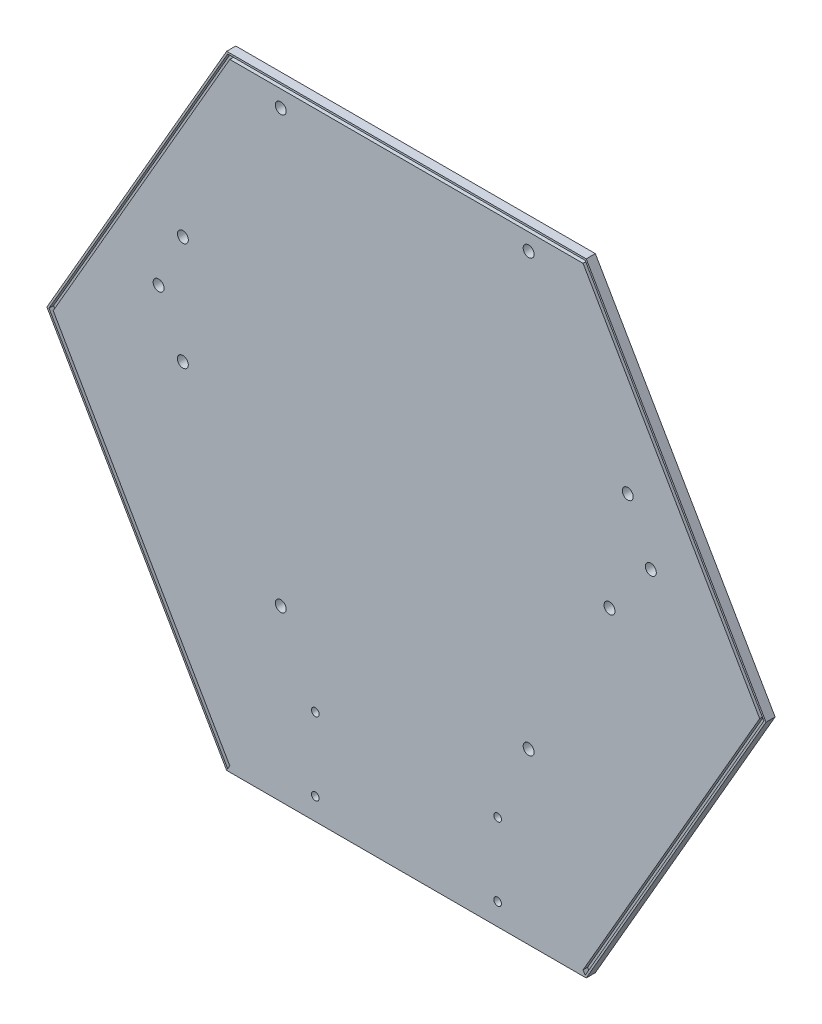
ISO-10303-21;
HEADER;
FILE_DESCRIPTION(('STEP AP214'),'2;1');
FILE_NAME('part.step','',(''),(''),'','','');
FILE_SCHEMA(('AUTOMOTIVE_DESIGN { 1 0 10303 214 1 1 1 1 }'));
ENDSEC;
DATA;
#1=APPLICATION_CONTEXT('core data for automotive mechanical design processes');
#2=APPLICATION_PROTOCOL_DEFINITION('international standard','automotive_design',2000,#1);
#3=PRODUCT_CONTEXT('',#1,'mechanical');
#4=PRODUCT('Part','Part','',(#3));
#5=PRODUCT_RELATED_PRODUCT_CATEGORY('part','',(#4));
#6=PRODUCT_DEFINITION_FORMATION('','',#4);
#7=PRODUCT_DEFINITION_CONTEXT('part definition',#1,'design');
#8=PRODUCT_DEFINITION('design','',#6,#7);
#9=PRODUCT_DEFINITION_SHAPE('','',#8);
#10=(LENGTH_UNIT() NAMED_UNIT(*) SI_UNIT(.MILLI.,.METRE.));
#11=(NAMED_UNIT(*) PLANE_ANGLE_UNIT() SI_UNIT($,.RADIAN.));
#12=(NAMED_UNIT(*) SI_UNIT($,.STERADIAN.) SOLID_ANGLE_UNIT());
#13=UNCERTAINTY_MEASURE_WITH_UNIT(LENGTH_MEASURE(1.E-05),#10,'distance_accuracy_value','');
#14=(GEOMETRIC_REPRESENTATION_CONTEXT(3) GLOBAL_UNCERTAINTY_ASSIGNED_CONTEXT((#13)) GLOBAL_UNIT_ASSIGNED_CONTEXT((#10,
#11,#12)) REPRESENTATION_CONTEXT('',''));
#15=CARTESIAN_POINT('',(0.,0.,0.));
#16=DIRECTION('',(0.,0.,1.));
#17=DIRECTION('',(1.,0.,0.));
#18=AXIS2_PLACEMENT_3D('',#15,#16,#17);
#19=CARTESIAN_POINT('',(0.,0.,25.));
#20=DIRECTION('',(0.,0.,1.));
#21=DIRECTION('',(1.,0.,0.));
#22=AXIS2_PLACEMENT_3D('',#19,#20,#21);
#23=PLANE('',#22);
#24=CARTESIAN_POINT('',(50.9544013648364,-199.783155320155,25.));
#25=DIRECTION('',(0.,0.,1.));
#26=DIRECTION('',(-1.,0.,0.));
#27=AXIS2_PLACEMENT_3D('',#24,#25,#26);
#28=CIRCLE('',#27,2.1);
#29=CARTESIAN_POINT('',(48.8544013648363,-199.783155320155,25.));
#30=VERTEX_POINT('',#29);
#31=EDGE_CURVE('E344',#30,#30,#28,.T.);
#32=ORIENTED_EDGE('',*,*,#31,.F.);
#33=EDGE_LOOP('',(#32));
#34=FACE_BOUND('',#33,.T.);
#35=CARTESIAN_POINT('',(-49.0455986351637,-159.783155320155,25.));
#36=DIRECTION('',(0.,0.,1.));
#37=DIRECTION('',(1.,0.,0.));
#38=AXIS2_PLACEMENT_3D('',#35,#36,#37);
#39=CIRCLE('',#38,2.09999999999999);
#40=CARTESIAN_POINT('',(-46.9455986351637,-159.783155320155,25.));
#41=VERTEX_POINT('',#40);
#42=EDGE_CURVE('E337',#41,#41,#39,.T.);
#43=ORIENTED_EDGE('',*,*,#42,.F.);
#44=EDGE_LOOP('',(#43));
#45=FACE_BOUND('',#44,.T.);
#46=CARTESIAN_POINT('',(50.9544013648398,-159.783155320154,25.));
#47=DIRECTION('',(0.,0.,1.));
#48=DIRECTION('',(-1.,0.,0.));
#49=AXIS2_PLACEMENT_3D('',#46,#47,#48);
#50=CIRCLE('',#49,2.10000000000001);
#51=CARTESIAN_POINT('',(48.8544013648397,-159.783155320154,25.));
#52=VERTEX_POINT('',#51);
#53=EDGE_CURVE('E349',#52,#52,#50,.T.);
#54=ORIENTED_EDGE('',*,*,#53,.F.);
#55=EDGE_LOOP('',(#54));
#56=FACE_BOUND('',#55,.T.);
#57=CARTESIAN_POINT('',(-49.0455986351636,-199.783155320155,25.));
#58=DIRECTION('',(0.,0.,1.));
#59=DIRECTION('',(1.,0.,0.));
#60=AXIS2_PLACEMENT_3D('',#57,#58,#59);
#61=CIRCLE('',#60,2.1);
#62=CARTESIAN_POINT('',(-46.9455986351636,-199.783155320155,25.));
#63=VERTEX_POINT('',#62);
#64=EDGE_CURVE('E281',#63,#63,#61,.T.);
#65=ORIENTED_EDGE('',*,*,#64,.F.);
#66=EDGE_LOOP('',(#65));
#67=FACE_BOUND('',#66,.T.);
#68=CARTESIAN_POINT('',(-67.98,117.66,25.));
#69=DIRECTION('',(0.,0.,-1.));
#70=DIRECTION('',(-1.,0.,0.));
#71=AXIS2_PLACEMENT_3D('',#68,#69,#70);
#72=CIRCLE('',#71,3.00000000000001);
#73=CARTESIAN_POINT('',(-70.98,117.66,25.));
#74=VERTEX_POINT('',#73);
#75=EDGE_CURVE('E277',#74,#74,#72,.T.);
#76=ORIENTED_EDGE('',*,*,#75,.T.);
#77=EDGE_LOOP('',(#76));
#78=FACE_BOUND('',#77,.T.);
#79=CARTESIAN_POINT('',(-121.69,29.64,25.));
#80=DIRECTION('',(0.,0.,-1.));
#81=DIRECTION('',(-1.,0.,0.));
#82=AXIS2_PLACEMENT_3D('',#79,#80,#81);
#83=CIRCLE('',#82,3.00000000000001);
#84=CARTESIAN_POINT('',(-124.69,29.64,25.));
#85=VERTEX_POINT('',#84);
#86=EDGE_CURVE('E284',#85,#85,#83,.T.);
#87=ORIENTED_EDGE('',*,*,#86,.T.);
#88=EDGE_LOOP('',(#87));
#89=FACE_BOUND('',#88,.T.);
#90=CARTESIAN_POINT('',(-135.,0.,25.));
#91=DIRECTION('',(0.,0.,-1.));
#92=DIRECTION('',(-1.,0.,0.));
#93=AXIS2_PLACEMENT_3D('',#90,#91,#92);
#94=CIRCLE('',#93,2.99999999999999);
#95=CARTESIAN_POINT('',(-138.,0.,25.));
#96=VERTEX_POINT('',#95);
#97=EDGE_CURVE('E290',#96,#96,#94,.T.);
#98=ORIENTED_EDGE('',*,*,#97,.T.);
#99=EDGE_LOOP('',(#98));
#100=FACE_BOUND('',#99,.T.);
#101=CARTESIAN_POINT('',(-121.69,-29.68,25.));
#102=DIRECTION('',(0.,0.,-1.));
#103=DIRECTION('',(-1.,0.,0.));
#104=AXIS2_PLACEMENT_3D('',#101,#102,#103);
#105=CIRCLE('',#104,3.00000000000001);
#106=CARTESIAN_POINT('',(-124.69,-29.68,25.));
#107=VERTEX_POINT('',#106);
#108=EDGE_CURVE('E296',#107,#107,#105,.T.);
#109=ORIENTED_EDGE('',*,*,#108,.T.);
#110=EDGE_LOOP('',(#109));
#111=FACE_BOUND('',#110,.T.);
#112=CARTESIAN_POINT('',(-67.98,-118.86,25.));
#113=DIRECTION('',(0.,0.,-1.));
#114=DIRECTION('',(-1.,0.,0.));
#115=AXIS2_PLACEMENT_3D('',#112,#113,#114);
#116=CIRCLE('',#115,3.00000000000001);
#117=CARTESIAN_POINT('',(-70.98,-118.86,25.));
#118=VERTEX_POINT('',#117);
#119=EDGE_CURVE('E302',#118,#118,#116,.T.);
#120=ORIENTED_EDGE('',*,*,#119,.T.);
#121=EDGE_LOOP('',(#120));
#122=FACE_BOUND('',#121,.T.);
#123=CARTESIAN_POINT('',(67.98,-118.86,25.));
#124=DIRECTION('',(0.,0.,-1.));
#125=DIRECTION('',(-1.,0.,0.));
#126=AXIS2_PLACEMENT_3D('',#123,#124,#125);
#127=CIRCLE('',#126,3.00000000000001);
#128=CARTESIAN_POINT('',(64.98,-118.86,25.));
#129=VERTEX_POINT('',#128);
#130=EDGE_CURVE('E308',#129,#129,#127,.T.);
#131=ORIENTED_EDGE('',*,*,#130,.T.);
#132=EDGE_LOOP('',(#131));
#133=FACE_BOUND('',#132,.T.);
#134=CARTESIAN_POINT('',(112.33,-29.68,25.));
#135=DIRECTION('',(0.,0.,-1.));
#136=DIRECTION('',(-1.,0.,0.));
#137=AXIS2_PLACEMENT_3D('',#134,#135,#136);
#138=CIRCLE('',#137,3.00000000000001);
#139=CARTESIAN_POINT('',(109.33,-29.68,25.));
#140=VERTEX_POINT('',#139);
#141=EDGE_CURVE('E314',#140,#140,#138,.T.);
#142=ORIENTED_EDGE('',*,*,#141,.T.);
#143=EDGE_LOOP('',(#142));
#144=FACE_BOUND('',#143,.T.);
#145=CARTESIAN_POINT('',(135.,0.,25.));
#146=DIRECTION('',(0.,0.,-1.));
#147=DIRECTION('',(-1.,0.,0.));
#148=AXIS2_PLACEMENT_3D('',#145,#146,#147);
#149=CIRCLE('',#148,2.99999999999999);
#150=CARTESIAN_POINT('',(132.,0.,25.));
#151=VERTEX_POINT('',#150);
#152=EDGE_CURVE('E320',#151,#151,#149,.T.);
#153=ORIENTED_EDGE('',*,*,#152,.T.);
#154=EDGE_LOOP('',(#153));
#155=FACE_BOUND('',#154,.T.);
#156=CARTESIAN_POINT('',(122.33,29.64,25.));
#157=DIRECTION('',(0.,0.,-1.));
#158=DIRECTION('',(-1.,0.,0.));
#159=AXIS2_PLACEMENT_3D('',#156,#157,#158);
#160=CIRCLE('',#159,3.00000000000001);
#161=CARTESIAN_POINT('',(119.33,29.64,25.));
#162=VERTEX_POINT('',#161);
#163=EDGE_CURVE('E326',#162,#162,#160,.T.);
#164=ORIENTED_EDGE('',*,*,#163,.T.);
#165=EDGE_LOOP('',(#164));
#166=FACE_BOUND('',#165,.T.);
#167=CARTESIAN_POINT('',(67.98,117.66,25.));
#168=DIRECTION('',(0.,0.,-1.));
#169=DIRECTION('',(-1.,0.,0.));
#170=AXIS2_PLACEMENT_3D('',#167,#168,#169);
#171=CIRCLE('',#170,3.00000000000001);
#172=CARTESIAN_POINT('',(64.98,117.66,25.));
#173=VERTEX_POINT('',#172);
#174=EDGE_CURVE('E236',#173,#173,#171,.T.);
#175=ORIENTED_EDGE('',*,*,#174,.T.);
#176=EDGE_LOOP('',(#175));
#177=FACE_BOUND('',#176,.T.);
#178=DIRECTION('',(-0.499999999999995,-0.866025403784442,0.));
#179=VECTOR('',#178,1.);
#180=CARTESIAN_POINT('',(-97.6566945636222,129.815701356121,25.));
#181=LINE('',#180,#179);
#182=CARTESIAN_POINT('',(-97.6566945636222,129.815701356121,25.));
#183=VERTEX_POINT('',#182);
#184=CARTESIAN_POINT('',(-196.26779049208,-40.9837269820179,25.));
#185=VERTEX_POINT('',#184);
#186=EDGE_CURVE('E150',#183,#185,#181,.T.);
#187=ORIENTED_EDGE('',*,*,#186,.T.);
#188=DIRECTION('',(0.500000000000007,-0.866025403784434,0.));
#189=VECTOR('',#188,1.);
#190=CARTESIAN_POINT('',(-196.26779049208,-40.9837269820179,25.));
#191=LINE('',#190,#189);
#192=CARTESIAN_POINT('',(-97.6566945636199,-211.783155320155,25.));
#193=VERTEX_POINT('',#192);
#194=EDGE_CURVE('E100',#185,#193,#191,.T.);
#195=ORIENTED_EDGE('',*,*,#194,.T.);
#196=DIRECTION('',(1.,0.,0.));
#197=VECTOR('',#196,1.);
#198=CARTESIAN_POINT('',(-97.6566945636199,-211.783155320155,25.));
#199=LINE('',#198,#197);
#200=CARTESIAN_POINT('',(99.5654972932966,-211.783155320153,25.));
#201=VERTEX_POINT('',#200);
#202=EDGE_CURVE('E117',#193,#201,#199,.T.);
#203=ORIENTED_EDGE('',*,*,#202,.T.);
#204=DIRECTION('',(0.499999999999995,0.866025403784441,0.));
#205=VECTOR('',#204,1.);
#206=CARTESIAN_POINT('',(99.5654972932966,-211.783155320153,25.));
#207=LINE('',#206,#205);
#208=CARTESIAN_POINT('',(198.176593221753,-40.9837269820166,25.));
#209=VERTEX_POINT('',#208);
#210=EDGE_CURVE('E110',#201,#209,#207,.T.);
#211=ORIENTED_EDGE('',*,*,#210,.T.);
#212=DIRECTION('',(-0.500000000000001,0.866025403784438,0.));
#213=VECTOR('',#212,1.);
#214=CARTESIAN_POINT('',(198.176593221753,-40.9837269820166,25.));
#215=LINE('',#214,#213);
#216=CARTESIAN_POINT('',(99.5654972932943,129.815701356121,25.));
#217=VERTEX_POINT('',#216);
#218=EDGE_CURVE('E114',#209,#217,#215,.T.);
#219=ORIENTED_EDGE('',*,*,#218,.T.);
#220=DIRECTION('',(-1.,0.,0.));
#221=VECTOR('',#220,1.);
#222=CARTESIAN_POINT('',(99.5654972932943,129.815701356121,25.));
#223=LINE('',#222,#221);
#224=EDGE_CURVE('E65',#217,#183,#223,.T.);
#225=ORIENTED_EDGE('',*,*,#224,.T.);
#226=EDGE_LOOP('',(#187,#195,#203,#211,#219,#225));
#227=FACE_BOUND('',#226,.T.);
#228=DIRECTION('',(0.5,-0.866025403784439,0.));
#229=VECTOR('',#228,1.);
#230=CARTESIAN_POINT('',(-192.803688876942,-40.9837269820168,25.));
#231=LINE('',#230,#229);
#232=CARTESIAN_POINT('',(-192.803688876942,-40.9837269820168,25.));
#233=VERTEX_POINT('',#232);
#234=CARTESIAN_POINT('',(-95.9246437560529,-208.783155320155,25.));
#235=VERTEX_POINT('',#234);
#236=EDGE_CURVE('E201',#233,#235,#231,.T.);
#237=ORIENTED_EDGE('',*,*,#236,.T.);
#238=DIRECTION('',(-0.499999999999986,-0.866025403784446,0.));
#239=VECTOR('',#238,1.);
#240=CARTESIAN_POINT('',(-95.9246437560529,-208.783155320155,25.));
#241=LINE('',#240,#239);
#242=CARTESIAN_POINT('',(-97.0793442944321,-210.783155320155,25.));
#243=VERTEX_POINT('',#242);
#244=EDGE_CURVE('E56',#235,#243,#241,.T.);
#245=ORIENTED_EDGE('',*,*,#244,.T.);
#246=DIRECTION('',(-0.5,0.866025403784439,0.));
#247=VECTOR('',#246,1.);
#248=CARTESIAN_POINT('',(-97.0793442944321,-210.783155320155,25.));
#249=LINE('',#248,#247);
#250=CARTESIAN_POINT('',(-195.113089953701,-40.9837269820168,25.));
#251=VERTEX_POINT('',#250);
#252=EDGE_CURVE('E232',#243,#251,#249,.T.);
#253=ORIENTED_EDGE('',*,*,#252,.T.);
#254=DIRECTION('',(0.5,0.866025403784439,0.));
#255=VECTOR('',#254,1.);
#256=CARTESIAN_POINT('',(-195.113089953701,-40.9837269820168,25.));
#257=LINE('',#256,#255);
#258=CARTESIAN_POINT('',(-97.0793442944323,128.815701356121,25.));
#259=VERTEX_POINT('',#258);
#260=EDGE_CURVE('E229',#251,#259,#257,.T.);
#261=ORIENTED_EDGE('',*,*,#260,.T.);
#262=DIRECTION('',(1.,0.,0.));
#263=VECTOR('',#262,1.);
#264=CARTESIAN_POINT('',(-97.0793442944323,128.815701356121,25.));
#265=LINE('',#264,#263);
#266=CARTESIAN_POINT('',(98.9881470241049,128.815701356122,25.));
#267=VERTEX_POINT('',#266);
#268=EDGE_CURVE('E226',#259,#267,#265,.T.);
#269=ORIENTED_EDGE('',*,*,#268,.T.);
#270=DIRECTION('',(0.5,-0.866025403784439,0.));
#271=VECTOR('',#270,1.);
#272=CARTESIAN_POINT('',(98.9881470241049,128.815701356122,25.));
#273=LINE('',#272,#271);
#274=CARTESIAN_POINT('',(197.021892683374,-40.9837269820177,25.));
#275=VERTEX_POINT('',#274);
#276=EDGE_CURVE('E223',#267,#275,#273,.T.);
#277=ORIENTED_EDGE('',*,*,#276,.T.);
#278=DIRECTION('',(-0.5,-0.866025403784439,0.));
#279=VECTOR('',#278,1.);
#280=CARTESIAN_POINT('',(197.021892683374,-40.9837269820177,25.));
#281=LINE('',#280,#279);
#282=CARTESIAN_POINT('',(98.9881470241058,-210.783155320155,25.));
#283=VERTEX_POINT('',#282);
#284=EDGE_CURVE('E220',#275,#283,#281,.T.);
#285=ORIENTED_EDGE('',*,*,#284,.T.);
#286=DIRECTION('',(-0.499999999999972,0.866025403784455,0.));
#287=VECTOR('',#286,1.);
#288=CARTESIAN_POINT('',(98.9881470241058,-210.783155320155,25.));
#289=LINE('',#288,#287);
#290=CARTESIAN_POINT('',(97.8334464857266,-208.783155320155,25.));
#291=VERTEX_POINT('',#290);
#292=EDGE_CURVE('E217',#283,#291,#289,.T.);
#293=ORIENTED_EDGE('',*,*,#292,.T.);
#294=DIRECTION('',(0.5,0.866025403784439,0.));
#295=VECTOR('',#294,1.);
#296=CARTESIAN_POINT('',(97.8334464857266,-208.783155320155,25.));
#297=LINE('',#296,#295);
#298=CARTESIAN_POINT('',(194.712491606616,-40.9837269820176,25.));
#299=VERTEX_POINT('',#298);
#300=EDGE_CURVE('E214',#291,#299,#297,.T.);
#301=ORIENTED_EDGE('',*,*,#300,.T.);
#302=DIRECTION('',(-0.5,0.866025403784438,0.));
#303=VECTOR('',#302,1.);
#304=CARTESIAN_POINT('',(194.712491606616,-40.9837269820176,25.));
#305=LINE('',#304,#303);
#306=CARTESIAN_POINT('',(97.8334464857257,126.815701356121,25.));
#307=VERTEX_POINT('',#306);
#308=EDGE_CURVE('E211',#299,#307,#305,.T.);
#309=ORIENTED_EDGE('',*,*,#308,.T.);
#310=DIRECTION('',(-1.,0.,0.));
#311=VECTOR('',#310,1.);
#312=CARTESIAN_POINT('',(97.8334464857257,126.815701356121,25.));
#313=LINE('',#312,#311);
#314=CARTESIAN_POINT('',(-95.924643756053,126.815701356121,25.));
#315=VERTEX_POINT('',#314);
#316=EDGE_CURVE('E208',#307,#315,#313,.T.);
#317=ORIENTED_EDGE('',*,*,#316,.T.);
#318=DIRECTION('',(-0.5,-0.866025403784439,0.));
#319=VECTOR('',#318,1.);
#320=CARTESIAN_POINT('',(-95.924643756053,126.815701356121,25.));
#321=LINE('',#320,#319);
#322=EDGE_CURVE('E205',#315,#233,#321,.T.);
#323=ORIENTED_EDGE('',*,*,#322,.T.);
#324=EDGE_LOOP('',(#237,#245,#253,#261,#269,#277,#285,#293,#301,#309,#317,#323));
#325=FACE_BOUND('',#324,.T.);
#326=ADVANCED_FACE('F41',(#34,#45,#56,#67,#78,#89,#100,#111,#122,#133,#144,#155,#166,#177,#227,
#325),#23,.T.);
#327=CARTESIAN_POINT('',(-97.6566945636222,129.815701356121,25.));
#328=DIRECTION('',(0.866025403784442,-0.499999999999995,0.));
#329=DIRECTION('',(0.499999999999995,0.866025403784442,0.));
#330=AXIS2_PLACEMENT_3D('',#327,#328,#329);
#331=PLANE('',#330);
#332=DIRECTION('',(-0.499999999999995,-0.866025403784442,0.));
#333=VECTOR('',#332,1.);
#334=CARTESIAN_POINT('',(-97.6566945636222,129.815701356121,20.));
#335=LINE('',#334,#333);
#336=CARTESIAN_POINT('',(-97.6566945636222,129.815701356121,20.));
#337=VERTEX_POINT('',#336);
#338=CARTESIAN_POINT('',(-196.26779049208,-40.9837269820179,20.));
#339=VERTEX_POINT('',#338);
#340=EDGE_CURVE('E138',#337,#339,#335,.T.);
#341=ORIENTED_EDGE('',*,*,#340,.T.);
#342=DIRECTION('',(0.,0.,-1.));
#343=VECTOR('',#342,1.);
#344=CARTESIAN_POINT('',(-196.26779049208,-40.9837269820179,25.));
#345=LINE('',#344,#343);
#346=EDGE_CURVE('E11',#185,#339,#345,.T.);
#347=ORIENTED_EDGE('',*,*,#346,.F.);
#348=ORIENTED_EDGE('',*,*,#186,.F.);
#349=DIRECTION('',(0.,0.,-1.));
#350=VECTOR('',#349,1.);
#351=CARTESIAN_POINT('',(-97.6566945636222,129.815701356121,25.));
#352=LINE('',#351,#350);
#353=EDGE_CURVE('E134',#183,#337,#352,.T.);
#354=ORIENTED_EDGE('',*,*,#353,.T.);
#355=EDGE_LOOP('',(#341,#347,#348,#354));
#356=FACE_BOUND('',#355,.T.);
#357=ADVANCED_FACE('F43',(#356),#331,.F.);
#358=CARTESIAN_POINT('',(-196.26779049208,-40.9837269820179,25.));
#359=DIRECTION('',(0.866025403784435,0.500000000000007,0.));
#360=DIRECTION('',(-0.500000000000007,0.866025403784435,0.));
#361=AXIS2_PLACEMENT_3D('',#358,#359,#360);
#362=PLANE('',#361);
#363=DIRECTION('',(0.500000000000007,-0.866025403784434,0.));
#364=VECTOR('',#363,1.);
#365=CARTESIAN_POINT('',(-196.26779049208,-40.9837269820179,20.));
#366=LINE('',#365,#364);
#367=CARTESIAN_POINT('',(-97.6566945636199,-211.783155320155,20.));
#368=VERTEX_POINT('',#367);
#369=EDGE_CURVE('E141',#339,#368,#366,.T.);
#370=ORIENTED_EDGE('',*,*,#369,.T.);
#371=DIRECTION('',(0.,0.,-1.));
#372=VECTOR('',#371,1.);
#373=CARTESIAN_POINT('',(-97.6566945636199,-211.783155320155,25.));
#374=LINE('',#373,#372);
#375=EDGE_CURVE('E49',#193,#368,#374,.T.);
#376=ORIENTED_EDGE('',*,*,#375,.F.);
#377=ORIENTED_EDGE('',*,*,#194,.F.);
#378=ORIENTED_EDGE('',*,*,#346,.T.);
#379=EDGE_LOOP('',(#370,#376,#377,#378));
#380=FACE_BOUND('',#379,.T.);
#381=ADVANCED_FACE('F382',(#380),#362,.F.);
#382=CARTESIAN_POINT('',(-97.6566945636199,-211.783155320155,25.));
#383=DIRECTION('',(0.,1.,0.));
#384=DIRECTION('',(-1.,0.,0.));
#385=AXIS2_PLACEMENT_3D('',#382,#383,#384);
#386=PLANE('',#385);
#387=DIRECTION('',(1.,0.,0.));
#388=VECTOR('',#387,1.);
#389=CARTESIAN_POINT('',(-97.6566945636199,-211.783155320155,20.));
#390=LINE('',#389,#388);
#391=CARTESIAN_POINT('',(99.5654972932966,-211.783155320153,20.));
#392=VERTEX_POINT('',#391);
#393=EDGE_CURVE('E144',#368,#392,#390,.T.);
#394=ORIENTED_EDGE('',*,*,#393,.T.);
#395=DIRECTION('',(0.,0.,-1.));
#396=VECTOR('',#395,1.);
#397=CARTESIAN_POINT('',(99.5654972932966,-211.783155320153,25.));
#398=LINE('',#397,#396);
#399=EDGE_CURVE('E129',#201,#392,#398,.T.);
#400=ORIENTED_EDGE('',*,*,#399,.F.);
#401=ORIENTED_EDGE('',*,*,#202,.F.);
#402=ORIENTED_EDGE('',*,*,#375,.T.);
#403=EDGE_LOOP('',(#394,#400,#401,#402));
#404=FACE_BOUND('',#403,.T.);
#405=ADVANCED_FACE('F156',(#404),#386,.F.);
#406=CARTESIAN_POINT('',(99.5654972932966,-211.783155320153,25.));
#407=DIRECTION('',(-0.866025403784441,0.499999999999995,0.));
#408=DIRECTION('',(-0.499999999999995,-0.866025403784441,0.));
#409=AXIS2_PLACEMENT_3D('',#406,#407,#408);
#410=PLANE('',#409);
#411=DIRECTION('',(0.499999999999995,0.866025403784441,0.));
#412=VECTOR('',#411,1.);
#413=CARTESIAN_POINT('',(99.5654972932966,-211.783155320153,20.));
#414=LINE('',#413,#412);
#415=CARTESIAN_POINT('',(198.176593221753,-40.9837269820166,20.));
#416=VERTEX_POINT('',#415);
#417=EDGE_CURVE('E126',#392,#416,#414,.T.);
#418=ORIENTED_EDGE('',*,*,#417,.T.);
#419=DIRECTION('',(0.,0.,-1.));
#420=VECTOR('',#419,1.);
#421=CARTESIAN_POINT('',(198.176593221753,-40.9837269820166,25.));
#422=LINE('',#421,#420);
#423=EDGE_CURVE('E123',#209,#416,#422,.T.);
#424=ORIENTED_EDGE('',*,*,#423,.F.);
#425=ORIENTED_EDGE('',*,*,#210,.F.);
#426=ORIENTED_EDGE('',*,*,#399,.T.);
#427=EDGE_LOOP('',(#418,#424,#425,#426));
#428=FACE_BOUND('',#427,.T.);
#429=ADVANCED_FACE('F124',(#428),#410,.F.);
#430=CARTESIAN_POINT('',(198.176593221753,-40.9837269820166,25.));
#431=DIRECTION('',(-0.866025403784438,-0.500000000000001,0.));
#432=DIRECTION('',(0.500000000000001,-0.866025403784438,0.));
#433=AXIS2_PLACEMENT_3D('',#430,#431,#432);
#434=PLANE('',#433);
#435=DIRECTION('',(-0.500000000000001,0.866025403784438,0.));
#436=VECTOR('',#435,1.);
#437=CARTESIAN_POINT('',(198.176593221753,-40.9837269820166,20.));
#438=LINE('',#437,#436);
#439=CARTESIAN_POINT('',(99.5654972932943,129.815701356121,20.));
#440=VERTEX_POINT('',#439);
#441=EDGE_CURVE('E147',#416,#440,#438,.T.);
#442=ORIENTED_EDGE('',*,*,#441,.T.);
#443=DIRECTION('',(0.,0.,-1.));
#444=VECTOR('',#443,1.);
#445=CARTESIAN_POINT('',(99.5654972932943,129.815701356121,25.));
#446=LINE('',#445,#444);
#447=EDGE_CURVE('E130',#217,#440,#446,.T.);
#448=ORIENTED_EDGE('',*,*,#447,.F.);
#449=ORIENTED_EDGE('',*,*,#218,.F.);
#450=ORIENTED_EDGE('',*,*,#423,.T.);
#451=EDGE_LOOP('',(#442,#448,#449,#450));
#452=FACE_BOUND('',#451,.T.);
#453=ADVANCED_FACE('F132',(#452),#434,.F.);
#454=CARTESIAN_POINT('',(99.5654972932943,129.815701356121,25.));
#455=DIRECTION('',(0.,-1.,0.));
#456=DIRECTION('',(1.,0.,0.));
#457=AXIS2_PLACEMENT_3D('',#454,#455,#456);
#458=PLANE('',#457);
#459=DIRECTION('',(-1.,0.,0.));
#460=VECTOR('',#459,1.);
#461=CARTESIAN_POINT('',(99.5654972932943,129.815701356121,20.));
#462=LINE('',#461,#460);
#463=EDGE_CURVE('E92',#440,#337,#462,.T.);
#464=ORIENTED_EDGE('',*,*,#463,.T.);
#465=ORIENTED_EDGE('',*,*,#353,.F.);
#466=ORIENTED_EDGE('',*,*,#224,.F.);
#467=ORIENTED_EDGE('',*,*,#447,.T.);
#468=EDGE_LOOP('',(#464,#465,#466,#467));
#469=FACE_BOUND('',#468,.T.);
#470=ADVANCED_FACE('F160',(#469),#458,.F.);
#471=CARTESIAN_POINT('',(0.,0.,20.));
#472=DIRECTION('',(0.,0.,1.));
#473=DIRECTION('',(1.,0.,0.));
#474=AXIS2_PLACEMENT_3D('',#471,#472,#473);
#475=PLANE('',#474);
#476=CARTESIAN_POINT('',(50.9544013648364,-199.783155320155,20.));
#477=DIRECTION('',(0.,0.,1.));
#478=DIRECTION('',(-1.,0.,0.));
#479=AXIS2_PLACEMENT_3D('',#476,#477,#478);
#480=CIRCLE('',#479,2.1);
#481=CARTESIAN_POINT('',(48.8544013648363,-199.783155320155,20.));
#482=VERTEX_POINT('',#481);
#483=EDGE_CURVE('E334',#482,#482,#480,.T.);
#484=ORIENTED_EDGE('',*,*,#483,.T.);
#485=EDGE_LOOP('',(#484));
#486=FACE_BOUND('',#485,.T.);
#487=CARTESIAN_POINT('',(-49.0455986351637,-159.783155320155,20.));
#488=DIRECTION('',(0.,0.,1.));
#489=DIRECTION('',(1.,0.,0.));
#490=AXIS2_PLACEMENT_3D('',#487,#488,#489);
#491=CIRCLE('',#490,2.09999999999999);
#492=CARTESIAN_POINT('',(-46.9455986351637,-159.783155320155,20.));
#493=VERTEX_POINT('',#492);
#494=EDGE_CURVE('E340',#493,#493,#491,.T.);
#495=ORIENTED_EDGE('',*,*,#494,.T.);
#496=EDGE_LOOP('',(#495));
#497=FACE_BOUND('',#496,.T.);
#498=CARTESIAN_POINT('',(50.9544013648398,-159.783155320154,20.));
#499=DIRECTION('',(0.,0.,1.));
#500=DIRECTION('',(-1.,0.,0.));
#501=AXIS2_PLACEMENT_3D('',#498,#499,#500);
#502=CIRCLE('',#501,2.10000000000001);
#503=CARTESIAN_POINT('',(48.8544013648397,-159.783155320154,20.));
#504=VERTEX_POINT('',#503);
#505=EDGE_CURVE('E341',#504,#504,#502,.T.);
#506=ORIENTED_EDGE('',*,*,#505,.T.);
#507=EDGE_LOOP('',(#506));
#508=FACE_BOUND('',#507,.T.);
#509=CARTESIAN_POINT('',(-49.0455986351636,-199.783155320155,20.));
#510=DIRECTION('',(0.,0.,1.));
#511=DIRECTION('',(1.,0.,0.));
#512=AXIS2_PLACEMENT_3D('',#509,#510,#511);
#513=CIRCLE('',#512,2.1);
#514=CARTESIAN_POINT('',(-46.9455986351636,-199.783155320155,20.));
#515=VERTEX_POINT('',#514);
#516=EDGE_CURVE('E331',#515,#515,#513,.T.);
#517=ORIENTED_EDGE('',*,*,#516,.T.);
#518=EDGE_LOOP('',(#517));
#519=FACE_BOUND('',#518,.T.);
#520=CARTESIAN_POINT('',(-67.98,117.66,20.));
#521=DIRECTION('',(0.,0.,-1.));
#522=DIRECTION('',(-1.,0.,0.));
#523=AXIS2_PLACEMENT_3D('',#520,#521,#522);
#524=CIRCLE('',#523,3.00000000000001);
#525=CARTESIAN_POINT('',(-70.98,117.66,20.));
#526=VERTEX_POINT('',#525);
#527=EDGE_CURVE('E280',#526,#526,#524,.T.);
#528=ORIENTED_EDGE('',*,*,#527,.F.);
#529=EDGE_LOOP('',(#528));
#530=FACE_BOUND('',#529,.T.);
#531=CARTESIAN_POINT('',(-121.69,29.64,20.));
#532=DIRECTION('',(0.,0.,-1.));
#533=DIRECTION('',(-1.,0.,0.));
#534=AXIS2_PLACEMENT_3D('',#531,#532,#533);
#535=CIRCLE('',#534,3.00000000000001);
#536=CARTESIAN_POINT('',(-124.69,29.64,20.));
#537=VERTEX_POINT('',#536);
#538=EDGE_CURVE('E287',#537,#537,#535,.T.);
#539=ORIENTED_EDGE('',*,*,#538,.F.);
#540=EDGE_LOOP('',(#539));
#541=FACE_BOUND('',#540,.T.);
#542=CARTESIAN_POINT('',(-135.,0.,20.));
#543=DIRECTION('',(0.,0.,-1.));
#544=DIRECTION('',(-1.,0.,0.));
#545=AXIS2_PLACEMENT_3D('',#542,#543,#544);
#546=CIRCLE('',#545,2.99999999999999);
#547=CARTESIAN_POINT('',(-138.,0.,20.));
#548=VERTEX_POINT('',#547);
#549=EDGE_CURVE('E293',#548,#548,#546,.T.);
#550=ORIENTED_EDGE('',*,*,#549,.F.);
#551=EDGE_LOOP('',(#550));
#552=FACE_BOUND('',#551,.T.);
#553=CARTESIAN_POINT('',(-121.69,-29.68,20.));
#554=DIRECTION('',(0.,0.,-1.));
#555=DIRECTION('',(-1.,0.,0.));
#556=AXIS2_PLACEMENT_3D('',#553,#554,#555);
#557=CIRCLE('',#556,3.00000000000001);
#558=CARTESIAN_POINT('',(-124.69,-29.68,20.));
#559=VERTEX_POINT('',#558);
#560=EDGE_CURVE('E299',#559,#559,#557,.T.);
#561=ORIENTED_EDGE('',*,*,#560,.F.);
#562=EDGE_LOOP('',(#561));
#563=FACE_BOUND('',#562,.T.);
#564=CARTESIAN_POINT('',(-67.98,-118.86,20.));
#565=DIRECTION('',(0.,0.,-1.));
#566=DIRECTION('',(-1.,0.,0.));
#567=AXIS2_PLACEMENT_3D('',#564,#565,#566);
#568=CIRCLE('',#567,3.00000000000001);
#569=CARTESIAN_POINT('',(-70.98,-118.86,20.));
#570=VERTEX_POINT('',#569);
#571=EDGE_CURVE('E305',#570,#570,#568,.T.);
#572=ORIENTED_EDGE('',*,*,#571,.F.);
#573=EDGE_LOOP('',(#572));
#574=FACE_BOUND('',#573,.T.);
#575=CARTESIAN_POINT('',(67.98,-118.86,20.));
#576=DIRECTION('',(0.,0.,-1.));
#577=DIRECTION('',(-1.,0.,0.));
#578=AXIS2_PLACEMENT_3D('',#575,#576,#577);
#579=CIRCLE('',#578,3.00000000000001);
#580=CARTESIAN_POINT('',(64.98,-118.86,20.));
#581=VERTEX_POINT('',#580);
#582=EDGE_CURVE('E311',#581,#581,#579,.T.);
#583=ORIENTED_EDGE('',*,*,#582,.F.);
#584=EDGE_LOOP('',(#583));
#585=FACE_BOUND('',#584,.T.);
#586=CARTESIAN_POINT('',(112.33,-29.68,20.));
#587=DIRECTION('',(0.,0.,-1.));
#588=DIRECTION('',(-1.,0.,0.));
#589=AXIS2_PLACEMENT_3D('',#586,#587,#588);
#590=CIRCLE('',#589,3.00000000000001);
#591=CARTESIAN_POINT('',(109.33,-29.68,20.));
#592=VERTEX_POINT('',#591);
#593=EDGE_CURVE('E317',#592,#592,#590,.T.);
#594=ORIENTED_EDGE('',*,*,#593,.F.);
#595=EDGE_LOOP('',(#594));
#596=FACE_BOUND('',#595,.T.);
#597=CARTESIAN_POINT('',(135.,0.,20.));
#598=DIRECTION('',(0.,0.,-1.));
#599=DIRECTION('',(-1.,0.,0.));
#600=AXIS2_PLACEMENT_3D('',#597,#598,#599);
#601=CIRCLE('',#600,2.99999999999999);
#602=CARTESIAN_POINT('',(132.,0.,20.));
#603=VERTEX_POINT('',#602);
#604=EDGE_CURVE('E323',#603,#603,#601,.T.);
#605=ORIENTED_EDGE('',*,*,#604,.F.);
#606=EDGE_LOOP('',(#605));
#607=FACE_BOUND('',#606,.T.);
#608=CARTESIAN_POINT('',(122.33,29.64,20.));
#609=DIRECTION('',(0.,0.,-1.));
#610=DIRECTION('',(-1.,0.,0.));
#611=AXIS2_PLACEMENT_3D('',#608,#609,#610);
#612=CIRCLE('',#611,3.00000000000001);
#613=CARTESIAN_POINT('',(119.33,29.64,20.));
#614=VERTEX_POINT('',#613);
#615=EDGE_CURVE('E274',#614,#614,#612,.T.);
#616=ORIENTED_EDGE('',*,*,#615,.F.);
#617=EDGE_LOOP('',(#616));
#618=FACE_BOUND('',#617,.T.);
#619=CARTESIAN_POINT('',(67.98,117.66,20.));
#620=DIRECTION('',(0.,0.,-1.));
#621=DIRECTION('',(-1.,0.,0.));
#622=AXIS2_PLACEMENT_3D('',#619,#620,#621);
#623=CIRCLE('',#622,3.00000000000001);
#624=CARTESIAN_POINT('',(64.98,117.66,20.));
#625=VERTEX_POINT('',#624);
#626=EDGE_CURVE('E271',#625,#625,#623,.T.);
#627=ORIENTED_EDGE('',*,*,#626,.F.);
#628=EDGE_LOOP('',(#627));
#629=FACE_BOUND('',#628,.T.);
#630=ORIENTED_EDGE('',*,*,#340,.F.);
#631=ORIENTED_EDGE('',*,*,#463,.F.);
#632=ORIENTED_EDGE('',*,*,#441,.F.);
#633=ORIENTED_EDGE('',*,*,#417,.F.);
#634=ORIENTED_EDGE('',*,*,#393,.F.);
#635=ORIENTED_EDGE('',*,*,#369,.F.);
#636=EDGE_LOOP('',(#630,#631,#632,#633,#634,#635));
#637=FACE_BOUND('',#636,.T.);
#638=ADVANCED_FACE('F159',(#486,#497,#508,#519,#530,#541,#552,#563,#574,#585,#596,#607,#618,
#629,#637),#475,.F.);
#639=CARTESIAN_POINT('',(-95.9246437560529,-208.783155320155,22.5));
#640=DIRECTION('',(-0.866025403784446,0.499999999999986,0.));
#641=DIRECTION('',(-0.499999999999986,-0.866025403784446,0.));
#642=AXIS2_PLACEMENT_3D('',#639,#640,#641);
#643=PLANE('',#642);
#644=ORIENTED_EDGE('',*,*,#244,.F.);
#645=DIRECTION('',(0.,0.,1.));
#646=VECTOR('',#645,1.);
#647=CARTESIAN_POINT('',(-95.9246437560529,-208.783155320155,22.5));
#648=LINE('',#647,#646);
#649=CARTESIAN_POINT('',(-95.9246437560529,-208.783155320155,22.5));
#650=VERTEX_POINT('',#649);
#651=EDGE_CURVE('E198',#650,#235,#648,.T.);
#652=ORIENTED_EDGE('',*,*,#651,.F.);
#653=DIRECTION('',(-0.499999999999986,-0.866025403784446,0.));
#654=VECTOR('',#653,1.);
#655=CARTESIAN_POINT('',(-95.9246437560529,-208.783155320155,22.5));
#656=LINE('',#655,#654);
#657=CARTESIAN_POINT('',(-97.0793442944321,-210.783155320155,22.5));
#658=VERTEX_POINT('',#657);
#659=EDGE_CURVE('E204',#650,#658,#656,.T.);
#660=ORIENTED_EDGE('',*,*,#659,.T.);
#661=DIRECTION('',(0.,0.,1.));
#662=VECTOR('',#661,1.);
#663=CARTESIAN_POINT('',(-97.0793442944321,-210.783155320155,22.5));
#664=LINE('',#663,#662);
#665=EDGE_CURVE('E142',#658,#243,#664,.T.);
#666=ORIENTED_EDGE('',*,*,#665,.T.);
#667=EDGE_LOOP('',(#644,#652,#660,#666));
#668=FACE_BOUND('',#667,.T.);
#669=ADVANCED_FACE('F387',(#668),#643,.T.);
#670=CARTESIAN_POINT('',(-97.0793442944321,-210.783155320155,22.5));
#671=DIRECTION('',(0.866025403784438,0.5,0.));
#672=DIRECTION('',(-0.5,0.866025403784439,0.));
#673=AXIS2_PLACEMENT_3D('',#670,#671,#672);
#674=PLANE('',#673);
#675=ORIENTED_EDGE('',*,*,#252,.F.);
#676=ORIENTED_EDGE('',*,*,#665,.F.);
#677=DIRECTION('',(-0.5,0.866025403784439,0.));
#678=VECTOR('',#677,1.);
#679=CARTESIAN_POINT('',(-97.0793442944321,-210.783155320155,22.5));
#680=LINE('',#679,#678);
#681=CARTESIAN_POINT('',(-195.113089953701,-40.9837269820168,22.5));
#682=VERTEX_POINT('',#681);
#683=EDGE_CURVE('E266',#658,#682,#680,.T.);
#684=ORIENTED_EDGE('',*,*,#683,.T.);
#685=DIRECTION('',(0.,0.,1.));
#686=VECTOR('',#685,1.);
#687=CARTESIAN_POINT('',(-195.113089953701,-40.9837269820168,22.5));
#688=LINE('',#687,#686);
#689=EDGE_CURVE('E168',#682,#251,#688,.T.);
#690=ORIENTED_EDGE('',*,*,#689,.T.);
#691=EDGE_LOOP('',(#675,#676,#684,#690));
#692=FACE_BOUND('',#691,.T.);
#693=ADVANCED_FACE('F431',(#692),#674,.T.);
#694=CARTESIAN_POINT('',(-195.113089953701,-40.9837269820168,22.5));
#695=DIRECTION('',(0.866025403784439,-0.5,0.));
#696=DIRECTION('',(0.5,0.866025403784439,0.));
#697=AXIS2_PLACEMENT_3D('',#694,#695,#696);
#698=PLANE('',#697);
#699=ORIENTED_EDGE('',*,*,#260,.F.);
#700=ORIENTED_EDGE('',*,*,#689,.F.);
#701=DIRECTION('',(0.5,0.866025403784439,0.));
#702=VECTOR('',#701,1.);
#703=CARTESIAN_POINT('',(-195.113089953701,-40.9837269820168,22.5));
#704=LINE('',#703,#702);
#705=CARTESIAN_POINT('',(-97.0793442944323,128.815701356121,22.5));
#706=VERTEX_POINT('',#705);
#707=EDGE_CURVE('E263',#682,#706,#704,.T.);
#708=ORIENTED_EDGE('',*,*,#707,.T.);
#709=DIRECTION('',(0.,0.,1.));
#710=VECTOR('',#709,1.);
#711=CARTESIAN_POINT('',(-97.0793442944323,128.815701356121,22.5));
#712=LINE('',#711,#710);
#713=EDGE_CURVE('E171',#706,#259,#712,.T.);
#714=ORIENTED_EDGE('',*,*,#713,.T.);
#715=EDGE_LOOP('',(#699,#700,#708,#714));
#716=FACE_BOUND('',#715,.T.);
#717=ADVANCED_FACE('F439',(#716),#698,.T.);
#718=CARTESIAN_POINT('',(-97.0793442944323,128.815701356121,22.5));
#719=DIRECTION('',(0.,-1.,0.));
#720=DIRECTION('',(1.,0.,0.));
#721=AXIS2_PLACEMENT_3D('',#718,#719,#720);
#722=PLANE('',#721);
#723=ORIENTED_EDGE('',*,*,#268,.F.);
#724=ORIENTED_EDGE('',*,*,#713,.F.);
#725=DIRECTION('',(1.,0.,0.));
#726=VECTOR('',#725,1.);
#727=CARTESIAN_POINT('',(-97.0793442944323,128.815701356121,22.5));
#728=LINE('',#727,#726);
#729=CARTESIAN_POINT('',(98.9881470241049,128.815701356122,22.5));
#730=VERTEX_POINT('',#729);
#731=EDGE_CURVE('E260',#706,#730,#728,.T.);
#732=ORIENTED_EDGE('',*,*,#731,.T.);
#733=DIRECTION('',(0.,0.,1.));
#734=VECTOR('',#733,1.);
#735=CARTESIAN_POINT('',(98.9881470241049,128.815701356122,22.5));
#736=LINE('',#735,#734);
#737=EDGE_CURVE('E174',#730,#267,#736,.T.);
#738=ORIENTED_EDGE('',*,*,#737,.T.);
#739=EDGE_LOOP('',(#723,#724,#732,#738));
#740=FACE_BOUND('',#739,.T.);
#741=ADVANCED_FACE('F447',(#740),#722,.T.);
#742=CARTESIAN_POINT('',(98.9881470241049,128.815701356122,22.5));
#743=DIRECTION('',(-0.866025403784439,-0.5,0.));
#744=DIRECTION('',(0.5,-0.866025403784439,0.));
#745=AXIS2_PLACEMENT_3D('',#742,#743,#744);
#746=PLANE('',#745);
#747=ORIENTED_EDGE('',*,*,#276,.F.);
#748=ORIENTED_EDGE('',*,*,#737,.F.);
#749=DIRECTION('',(0.5,-0.866025403784439,0.));
#750=VECTOR('',#749,1.);
#751=CARTESIAN_POINT('',(98.9881470241049,128.815701356122,22.5));
#752=LINE('',#751,#750);
#753=CARTESIAN_POINT('',(197.021892683374,-40.9837269820177,22.5));
#754=VERTEX_POINT('',#753);
#755=EDGE_CURVE('E257',#730,#754,#752,.T.);
#756=ORIENTED_EDGE('',*,*,#755,.T.);
#757=DIRECTION('',(0.,0.,1.));
#758=VECTOR('',#757,1.);
#759=CARTESIAN_POINT('',(197.021892683374,-40.9837269820177,22.5));
#760=LINE('',#759,#758);
#761=EDGE_CURVE('E177',#754,#275,#760,.T.);
#762=ORIENTED_EDGE('',*,*,#761,.T.);
#763=EDGE_LOOP('',(#747,#748,#756,#762));
#764=FACE_BOUND('',#763,.T.);
#765=ADVANCED_FACE('F456',(#764),#746,.T.);
#766=CARTESIAN_POINT('',(197.021892683374,-40.9837269820177,22.5));
#767=DIRECTION('',(-0.866025403784438,0.5,0.));
#768=DIRECTION('',(-0.5,-0.866025403784439,0.));
#769=AXIS2_PLACEMENT_3D('',#766,#767,#768);
#770=PLANE('',#769);
#771=ORIENTED_EDGE('',*,*,#284,.F.);
#772=ORIENTED_EDGE('',*,*,#761,.F.);
#773=DIRECTION('',(-0.5,-0.866025403784439,0.));
#774=VECTOR('',#773,1.);
#775=CARTESIAN_POINT('',(197.021892683374,-40.9837269820177,22.5));
#776=LINE('',#775,#774);
#777=CARTESIAN_POINT('',(98.9881470241058,-210.783155320155,22.5));
#778=VERTEX_POINT('',#777);
#779=EDGE_CURVE('E254',#754,#778,#776,.T.);
#780=ORIENTED_EDGE('',*,*,#779,.T.);
#781=DIRECTION('',(0.,0.,1.));
#782=VECTOR('',#781,1.);
#783=CARTESIAN_POINT('',(98.9881470241058,-210.783155320155,22.5));
#784=LINE('',#783,#782);
#785=EDGE_CURVE('E180',#778,#283,#784,.T.);
#786=ORIENTED_EDGE('',*,*,#785,.T.);
#787=EDGE_LOOP('',(#771,#772,#780,#786));
#788=FACE_BOUND('',#787,.T.);
#789=ADVANCED_FACE('F465',(#788),#770,.T.);
#790=CARTESIAN_POINT('',(98.9881470241058,-210.783155320155,22.5));
#791=DIRECTION('',(0.866025403784455,0.499999999999972,0.));
#792=DIRECTION('',(-0.499999999999972,0.866025403784455,0.));
#793=AXIS2_PLACEMENT_3D('',#790,#791,#792);
#794=PLANE('',#793);
#795=ORIENTED_EDGE('',*,*,#292,.F.);
#796=ORIENTED_EDGE('',*,*,#785,.F.);
#797=DIRECTION('',(-0.499999999999972,0.866025403784455,0.));
#798=VECTOR('',#797,1.);
#799=CARTESIAN_POINT('',(98.9881470241058,-210.783155320155,22.5));
#800=LINE('',#799,#798);
#801=CARTESIAN_POINT('',(97.8334464857266,-208.783155320155,22.5));
#802=VERTEX_POINT('',#801);
#803=EDGE_CURVE('E251',#778,#802,#800,.T.);
#804=ORIENTED_EDGE('',*,*,#803,.T.);
#805=DIRECTION('',(0.,0.,1.));
#806=VECTOR('',#805,1.);
#807=CARTESIAN_POINT('',(97.8334464857266,-208.783155320155,22.5));
#808=LINE('',#807,#806);
#809=EDGE_CURVE('E183',#802,#291,#808,.T.);
#810=ORIENTED_EDGE('',*,*,#809,.T.);
#811=EDGE_LOOP('',(#795,#796,#804,#810));
#812=FACE_BOUND('',#811,.T.);
#813=ADVANCED_FACE('F474',(#812),#794,.T.);
#814=CARTESIAN_POINT('',(97.8334464857266,-208.783155320155,22.5));
#815=DIRECTION('',(0.866025403784439,-0.5,0.));
#816=DIRECTION('',(0.5,0.866025403784439,0.));
#817=AXIS2_PLACEMENT_3D('',#814,#815,#816);
#818=PLANE('',#817);
#819=ORIENTED_EDGE('',*,*,#300,.F.);
#820=ORIENTED_EDGE('',*,*,#809,.F.);
#821=DIRECTION('',(0.5,0.866025403784439,0.));
#822=VECTOR('',#821,1.);
#823=CARTESIAN_POINT('',(97.8334464857266,-208.783155320155,22.5));
#824=LINE('',#823,#822);
#825=CARTESIAN_POINT('',(194.712491606616,-40.9837269820176,22.5));
#826=VERTEX_POINT('',#825);
#827=EDGE_CURVE('E248',#802,#826,#824,.T.);
#828=ORIENTED_EDGE('',*,*,#827,.T.);
#829=DIRECTION('',(0.,0.,1.));
#830=VECTOR('',#829,1.);
#831=CARTESIAN_POINT('',(194.712491606616,-40.9837269820176,22.5));
#832=LINE('',#831,#830);
#833=EDGE_CURVE('E186',#826,#299,#832,.T.);
#834=ORIENTED_EDGE('',*,*,#833,.T.);
#835=EDGE_LOOP('',(#819,#820,#828,#834));
#836=FACE_BOUND('',#835,.T.);
#837=ADVANCED_FACE('F483',(#836),#818,.T.);
#838=CARTESIAN_POINT('',(194.712491606616,-40.9837269820176,22.5));
#839=DIRECTION('',(0.866025403784439,0.5,0.));
#840=DIRECTION('',(-0.5,0.866025403784439,0.));
#841=AXIS2_PLACEMENT_3D('',#838,#839,#840);
#842=PLANE('',#841);
#843=ORIENTED_EDGE('',*,*,#308,.F.);
#844=ORIENTED_EDGE('',*,*,#833,.F.);
#845=DIRECTION('',(-0.5,0.866025403784438,0.));
#846=VECTOR('',#845,1.);
#847=CARTESIAN_POINT('',(194.712491606616,-40.9837269820176,22.5));
#848=LINE('',#847,#846);
#849=CARTESIAN_POINT('',(97.8334464857257,126.815701356121,22.5));
#850=VERTEX_POINT('',#849);
#851=EDGE_CURVE('E245',#826,#850,#848,.T.);
#852=ORIENTED_EDGE('',*,*,#851,.T.);
#853=DIRECTION('',(0.,0.,1.));
#854=VECTOR('',#853,1.);
#855=CARTESIAN_POINT('',(97.8334464857257,126.815701356121,22.5));
#856=LINE('',#855,#854);
#857=EDGE_CURVE('E189',#850,#307,#856,.T.);
#858=ORIENTED_EDGE('',*,*,#857,.T.);
#859=EDGE_LOOP('',(#843,#844,#852,#858));
#860=FACE_BOUND('',#859,.T.);
#861=ADVANCED_FACE('F492',(#860),#842,.T.);
#862=CARTESIAN_POINT('',(97.8334464857257,126.815701356121,22.5));
#863=DIRECTION('',(0.,1.,0.));
#864=DIRECTION('',(0.,0.,1.));
#865=AXIS2_PLACEMENT_3D('',#862,#863,#864);
#866=PLANE('',#865);
#867=ORIENTED_EDGE('',*,*,#316,.F.);
#868=ORIENTED_EDGE('',*,*,#857,.F.);
#869=DIRECTION('',(-1.,0.,0.));
#870=VECTOR('',#869,1.);
#871=CARTESIAN_POINT('',(97.8334464857257,126.815701356121,22.5));
#872=LINE('',#871,#870);
#873=CARTESIAN_POINT('',(-95.924643756053,126.815701356121,22.5));
#874=VERTEX_POINT('',#873);
#875=EDGE_CURVE('E242',#850,#874,#872,.T.);
#876=ORIENTED_EDGE('',*,*,#875,.T.);
#877=DIRECTION('',(0.,0.,1.));
#878=VECTOR('',#877,1.);
#879=CARTESIAN_POINT('',(-95.924643756053,126.815701356121,22.5));
#880=LINE('',#879,#878);
#881=EDGE_CURVE('E192',#874,#315,#880,.T.);
#882=ORIENTED_EDGE('',*,*,#881,.T.);
#883=EDGE_LOOP('',(#867,#868,#876,#882));
#884=FACE_BOUND('',#883,.T.);
#885=ADVANCED_FACE('F501',(#884),#866,.T.);
#886=CARTESIAN_POINT('',(-95.924643756053,126.815701356121,22.5));
#887=DIRECTION('',(-0.866025403784439,0.5,0.));
#888=DIRECTION('',(-0.5,-0.866025403784439,0.));
#889=AXIS2_PLACEMENT_3D('',#886,#887,#888);
#890=PLANE('',#889);
#891=ORIENTED_EDGE('',*,*,#322,.F.);
#892=ORIENTED_EDGE('',*,*,#881,.F.);
#893=DIRECTION('',(-0.5,-0.866025403784439,0.));
#894=VECTOR('',#893,1.);
#895=CARTESIAN_POINT('',(-95.924643756053,126.815701356121,22.5));
#896=LINE('',#895,#894);
#897=CARTESIAN_POINT('',(-192.803688876942,-40.9837269820168,22.5));
#898=VERTEX_POINT('',#897);
#899=EDGE_CURVE('E239',#874,#898,#896,.T.);
#900=ORIENTED_EDGE('',*,*,#899,.T.);
#901=DIRECTION('',(0.,0.,1.));
#902=VECTOR('',#901,1.);
#903=CARTESIAN_POINT('',(-192.803688876942,-40.9837269820168,22.5));
#904=LINE('',#903,#902);
#905=EDGE_CURVE('E195',#898,#233,#904,.T.);
#906=ORIENTED_EDGE('',*,*,#905,.T.);
#907=EDGE_LOOP('',(#891,#892,#900,#906));
#908=FACE_BOUND('',#907,.T.);
#909=ADVANCED_FACE('F510',(#908),#890,.T.);
#910=CARTESIAN_POINT('',(-192.803688876942,-40.9837269820168,22.5));
#911=DIRECTION('',(-0.866025403784439,-0.5,0.));
#912=DIRECTION('',(0.5,-0.866025403784439,0.));
#913=AXIS2_PLACEMENT_3D('',#910,#911,#912);
#914=PLANE('',#913);
#915=ORIENTED_EDGE('',*,*,#236,.F.);
#916=ORIENTED_EDGE('',*,*,#905,.F.);
#917=DIRECTION('',(0.5,-0.866025403784439,0.));
#918=VECTOR('',#917,1.);
#919=CARTESIAN_POINT('',(-192.803688876942,-40.9837269820168,22.5));
#920=LINE('',#919,#918);
#921=EDGE_CURVE('E200',#898,#650,#920,.T.);
#922=ORIENTED_EDGE('',*,*,#921,.T.);
#923=ORIENTED_EDGE('',*,*,#651,.T.);
#924=EDGE_LOOP('',(#915,#916,#922,#923));
#925=FACE_BOUND('',#924,.T.);
#926=ADVANCED_FACE('F519',(#925),#914,.T.);
#927=CARTESIAN_POINT('',(0.,0.,22.5));
#928=DIRECTION('',(0.,0.,-1.));
#929=DIRECTION('',(-1.,0.,0.));
#930=AXIS2_PLACEMENT_3D('',#927,#928,#929);
#931=PLANE('',#930);
#932=ORIENTED_EDGE('',*,*,#659,.F.);
#933=ORIENTED_EDGE('',*,*,#921,.F.);
#934=ORIENTED_EDGE('',*,*,#899,.F.);
#935=ORIENTED_EDGE('',*,*,#875,.F.);
#936=ORIENTED_EDGE('',*,*,#851,.F.);
#937=ORIENTED_EDGE('',*,*,#827,.F.);
#938=ORIENTED_EDGE('',*,*,#803,.F.);
#939=ORIENTED_EDGE('',*,*,#779,.F.);
#940=ORIENTED_EDGE('',*,*,#755,.F.);
#941=ORIENTED_EDGE('',*,*,#731,.F.);
#942=ORIENTED_EDGE('',*,*,#707,.F.);
#943=ORIENTED_EDGE('',*,*,#683,.F.);
#944=EDGE_LOOP('',(#932,#933,#934,#935,#936,#937,#938,#939,#940,#941,#942,#943));
#945=FACE_BOUND('',#944,.T.);
#946=ADVANCED_FACE('F528',(#945),#931,.F.);
#947=CARTESIAN_POINT('',(67.98,117.66,25.));
#948=DIRECTION('',(0.,0.,-1.));
#949=DIRECTION('',(-1.,0.,0.));
#950=AXIS2_PLACEMENT_3D('',#947,#948,#949);
#951=CYLINDRICAL_SURFACE('',#950,3.00000000000001);
#952=ORIENTED_EDGE('',*,*,#174,.F.);
#953=EDGE_LOOP('',(#952));
#954=FACE_BOUND('',#953,.T.);
#955=ORIENTED_EDGE('',*,*,#626,.T.);
#956=EDGE_LOOP('',(#955));
#957=FACE_BOUND('',#956,.T.);
#958=ADVANCED_FACE('F537',(#954,#957),#951,.F.);
#959=CARTESIAN_POINT('',(122.33,29.64,25.));
#960=DIRECTION('',(0.,0.,-1.));
#961=DIRECTION('',(-1.,0.,0.));
#962=AXIS2_PLACEMENT_3D('',#959,#960,#961);
#963=CYLINDRICAL_SURFACE('',#962,3.00000000000001);
#964=ORIENTED_EDGE('',*,*,#163,.F.);
#965=EDGE_LOOP('',(#964));
#966=FACE_BOUND('',#965,.T.);
#967=ORIENTED_EDGE('',*,*,#615,.T.);
#968=EDGE_LOOP('',(#967));
#969=FACE_BOUND('',#968,.T.);
#970=ADVANCED_FACE('F546',(#966,#969),#963,.F.);
#971=CARTESIAN_POINT('',(135.,0.,25.));
#972=DIRECTION('',(0.,0.,-1.));
#973=DIRECTION('',(-1.,0.,0.));
#974=AXIS2_PLACEMENT_3D('',#971,#972,#973);
#975=CYLINDRICAL_SURFACE('',#974,2.99999999999999);
#976=ORIENTED_EDGE('',*,*,#152,.F.);
#977=EDGE_LOOP('',(#976));
#978=FACE_BOUND('',#977,.T.);
#979=ORIENTED_EDGE('',*,*,#604,.T.);
#980=EDGE_LOOP('',(#979));
#981=FACE_BOUND('',#980,.T.);
#982=ADVANCED_FACE('F555',(#978,#981),#975,.F.);
#983=CARTESIAN_POINT('',(112.33,-29.68,25.));
#984=DIRECTION('',(0.,0.,-1.));
#985=DIRECTION('',(-1.,0.,0.));
#986=AXIS2_PLACEMENT_3D('',#983,#984,#985);
#987=CYLINDRICAL_SURFACE('',#986,3.00000000000001);
#988=ORIENTED_EDGE('',*,*,#141,.F.);
#989=EDGE_LOOP('',(#988));
#990=FACE_BOUND('',#989,.T.);
#991=ORIENTED_EDGE('',*,*,#593,.T.);
#992=EDGE_LOOP('',(#991));
#993=FACE_BOUND('',#992,.T.);
#994=ADVANCED_FACE('F564',(#990,#993),#987,.F.);
#995=CARTESIAN_POINT('',(67.98,-118.86,25.));
#996=DIRECTION('',(0.,0.,-1.));
#997=DIRECTION('',(-1.,0.,0.));
#998=AXIS2_PLACEMENT_3D('',#995,#996,#997);
#999=CYLINDRICAL_SURFACE('',#998,3.00000000000001);
#1000=ORIENTED_EDGE('',*,*,#130,.F.);
#1001=EDGE_LOOP('',(#1000));
#1002=FACE_BOUND('',#1001,.T.);
#1003=ORIENTED_EDGE('',*,*,#582,.T.);
#1004=EDGE_LOOP('',(#1003));
#1005=FACE_BOUND('',#1004,.T.);
#1006=ADVANCED_FACE('F573',(#1002,#1005),#999,.F.);
#1007=CARTESIAN_POINT('',(-67.98,-118.86,25.));
#1008=DIRECTION('',(0.,0.,-1.));
#1009=DIRECTION('',(-1.,0.,0.));
#1010=AXIS2_PLACEMENT_3D('',#1007,#1008,#1009);
#1011=CYLINDRICAL_SURFACE('',#1010,3.00000000000001);
#1012=ORIENTED_EDGE('',*,*,#119,.F.);
#1013=EDGE_LOOP('',(#1012));
#1014=FACE_BOUND('',#1013,.T.);
#1015=ORIENTED_EDGE('',*,*,#571,.T.);
#1016=EDGE_LOOP('',(#1015));
#1017=FACE_BOUND('',#1016,.T.);
#1018=ADVANCED_FACE('F582',(#1014,#1017),#1011,.F.);
#1019=CARTESIAN_POINT('',(-121.69,-29.68,25.));
#1020=DIRECTION('',(0.,0.,-1.));
#1021=DIRECTION('',(-1.,0.,0.));
#1022=AXIS2_PLACEMENT_3D('',#1019,#1020,#1021);
#1023=CYLINDRICAL_SURFACE('',#1022,3.00000000000001);
#1024=ORIENTED_EDGE('',*,*,#108,.F.);
#1025=EDGE_LOOP('',(#1024));
#1026=FACE_BOUND('',#1025,.T.);
#1027=ORIENTED_EDGE('',*,*,#560,.T.);
#1028=EDGE_LOOP('',(#1027));
#1029=FACE_BOUND('',#1028,.T.);
#1030=ADVANCED_FACE('F591',(#1026,#1029),#1023,.F.);
#1031=CARTESIAN_POINT('',(-135.,0.,25.));
#1032=DIRECTION('',(0.,0.,-1.));
#1033=DIRECTION('',(-1.,0.,0.));
#1034=AXIS2_PLACEMENT_3D('',#1031,#1032,#1033);
#1035=CYLINDRICAL_SURFACE('',#1034,2.99999999999999);
#1036=ORIENTED_EDGE('',*,*,#97,.F.);
#1037=EDGE_LOOP('',(#1036));
#1038=FACE_BOUND('',#1037,.T.);
#1039=ORIENTED_EDGE('',*,*,#549,.T.);
#1040=EDGE_LOOP('',(#1039));
#1041=FACE_BOUND('',#1040,.T.);
#1042=ADVANCED_FACE('F600',(#1038,#1041),#1035,.F.);
#1043=CARTESIAN_POINT('',(-121.69,29.64,25.));
#1044=DIRECTION('',(0.,0.,-1.));
#1045=DIRECTION('',(-1.,0.,0.));
#1046=AXIS2_PLACEMENT_3D('',#1043,#1044,#1045);
#1047=CYLINDRICAL_SURFACE('',#1046,3.00000000000001);
#1048=ORIENTED_EDGE('',*,*,#86,.F.);
#1049=EDGE_LOOP('',(#1048));
#1050=FACE_BOUND('',#1049,.T.);
#1051=ORIENTED_EDGE('',*,*,#538,.T.);
#1052=EDGE_LOOP('',(#1051));
#1053=FACE_BOUND('',#1052,.T.);
#1054=ADVANCED_FACE('F609',(#1050,#1053),#1047,.F.);
#1055=CARTESIAN_POINT('',(-67.98,117.66,25.));
#1056=DIRECTION('',(0.,0.,-1.));
#1057=DIRECTION('',(-1.,0.,0.));
#1058=AXIS2_PLACEMENT_3D('',#1055,#1056,#1057);
#1059=CYLINDRICAL_SURFACE('',#1058,3.00000000000001);
#1060=ORIENTED_EDGE('',*,*,#75,.F.);
#1061=EDGE_LOOP('',(#1060));
#1062=FACE_BOUND('',#1061,.T.);
#1063=ORIENTED_EDGE('',*,*,#527,.T.);
#1064=EDGE_LOOP('',(#1063));
#1065=FACE_BOUND('',#1064,.T.);
#1066=ADVANCED_FACE('F370',(#1062,#1065),#1059,.F.);
#1067=CARTESIAN_POINT('',(-49.0455986351636,-199.783155320155,25.));
#1068=DIRECTION('',(0.,0.,-1.));
#1069=DIRECTION('',(-1.,0.,0.));
#1070=AXIS2_PLACEMENT_3D('',#1067,#1068,#1069);
#1071=CYLINDRICAL_SURFACE('',#1070,2.1);
#1072=ORIENTED_EDGE('',*,*,#64,.T.);
#1073=EDGE_LOOP('',(#1072));
#1074=FACE_BOUND('',#1073,.T.);
#1075=ORIENTED_EDGE('',*,*,#516,.F.);
#1076=EDGE_LOOP('',(#1075));
#1077=FACE_BOUND('',#1076,.T.);
#1078=ADVANCED_FACE('F360',(#1074,#1077),#1071,.F.);
#1079=CARTESIAN_POINT('',(50.9544013648398,-159.783155320154,25.));
#1080=DIRECTION('',(0.,0.,-1.));
#1081=DIRECTION('',(-1.,0.,0.));
#1082=AXIS2_PLACEMENT_3D('',#1079,#1080,#1081);
#1083=CYLINDRICAL_SURFACE('',#1082,2.10000000000001);
#1084=ORIENTED_EDGE('',*,*,#53,.T.);
#1085=EDGE_LOOP('',(#1084));
#1086=FACE_BOUND('',#1085,.T.);
#1087=ORIENTED_EDGE('',*,*,#505,.F.);
#1088=EDGE_LOOP('',(#1087));
#1089=FACE_BOUND('',#1088,.T.);
#1090=ADVANCED_FACE('F357',(#1086,#1089),#1083,.F.);
#1091=CARTESIAN_POINT('',(-49.0455986351637,-159.783155320155,25.));
#1092=DIRECTION('',(0.,0.,-1.));
#1093=DIRECTION('',(-1.,0.,0.));
#1094=AXIS2_PLACEMENT_3D('',#1091,#1092,#1093);
#1095=CYLINDRICAL_SURFACE('',#1094,2.09999999999999);
#1096=ORIENTED_EDGE('',*,*,#42,.T.);
#1097=EDGE_LOOP('',(#1096));
#1098=FACE_BOUND('',#1097,.T.);
#1099=ORIENTED_EDGE('',*,*,#494,.F.);
#1100=EDGE_LOOP('',(#1099));
#1101=FACE_BOUND('',#1100,.T.);
#1102=ADVANCED_FACE('F359',(#1098,#1101),#1095,.F.);
#1103=CARTESIAN_POINT('',(50.9544013648364,-199.783155320155,25.));
#1104=DIRECTION('',(0.,0.,-1.));
#1105=DIRECTION('',(-1.,0.,0.));
#1106=AXIS2_PLACEMENT_3D('',#1103,#1104,#1105);
#1107=CYLINDRICAL_SURFACE('',#1106,2.1);
#1108=ORIENTED_EDGE('',*,*,#31,.T.);
#1109=EDGE_LOOP('',(#1108));
#1110=FACE_BOUND('',#1109,.T.);
#1111=ORIENTED_EDGE('',*,*,#483,.F.);
#1112=EDGE_LOOP('',(#1111));
#1113=FACE_BOUND('',#1112,.T.);
#1114=ADVANCED_FACE('F367',(#1110,#1113),#1107,.F.);
#1115=CLOSED_SHELL('',(#326,#357,#381,#405,#429,#453,#470,#638,#669,#693,#717,#741,#765,#789,
#813,#837,#861,#885,#909,#926,#946,#958,#970,#982,#994,#1006,#1018,#1030,#1042,#1054,#1066,
#1078,#1090,#1102,#1114));
#1116=MANIFOLD_SOLID_BREP('B2',#1115);
#1117=ADVANCED_BREP_SHAPE_REPRESENTATION('',(#18,#1116),#14);
#1118=SHAPE_DEFINITION_REPRESENTATION(#9,#1117);
ENDSEC;
END-ISO-10303-21;
